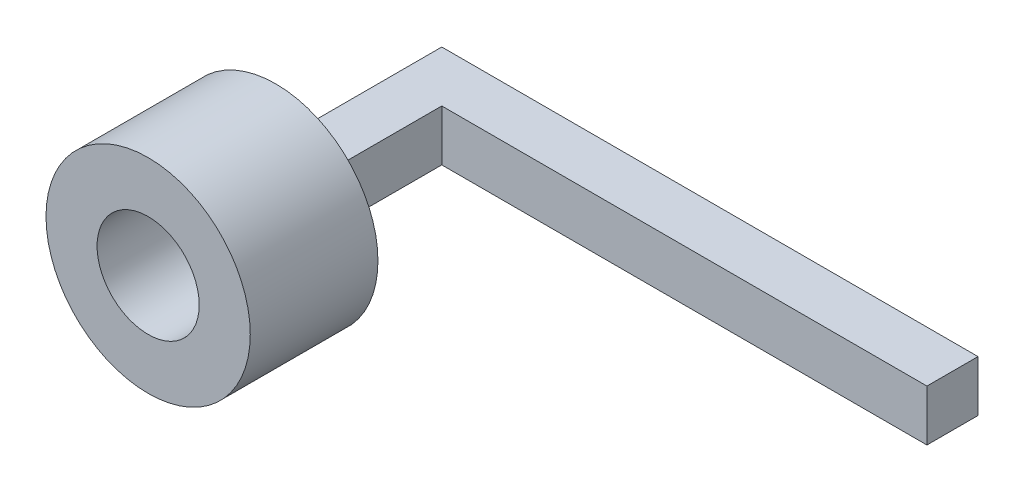
ISO-10303-21;
HEADER;
FILE_DESCRIPTION(('STEP AP214'),'2;1');
FILE_NAME('part.step','',(''),(''),'','','');
FILE_SCHEMA(('AUTOMOTIVE_DESIGN { 1 0 10303 214 1 1 1 1 }'));
ENDSEC;
DATA;
#1=APPLICATION_CONTEXT('core data for automotive mechanical design processes');
#2=APPLICATION_PROTOCOL_DEFINITION('international standard','automotive_design',2000,#1);
#3=PRODUCT_CONTEXT('',#1,'mechanical');
#4=PRODUCT('Part','Part','',(#3));
#5=PRODUCT_RELATED_PRODUCT_CATEGORY('part','',(#4));
#6=PRODUCT_DEFINITION_FORMATION('','',#4);
#7=PRODUCT_DEFINITION_CONTEXT('part definition',#1,'design');
#8=PRODUCT_DEFINITION('design','',#6,#7);
#9=PRODUCT_DEFINITION_SHAPE('','',#8);
#10=(LENGTH_UNIT() NAMED_UNIT(*) SI_UNIT(.MILLI.,.METRE.));
#11=(NAMED_UNIT(*) PLANE_ANGLE_UNIT() SI_UNIT($,.RADIAN.));
#12=(NAMED_UNIT(*) SI_UNIT($,.STERADIAN.) SOLID_ANGLE_UNIT());
#13=UNCERTAINTY_MEASURE_WITH_UNIT(LENGTH_MEASURE(1.E-05),#10,'distance_accuracy_value','');
#14=(GEOMETRIC_REPRESENTATION_CONTEXT(3) GLOBAL_UNCERTAINTY_ASSIGNED_CONTEXT((#13)) GLOBAL_UNIT_ASSIGNED_CONTEXT((#10,
#11,#12)) REPRESENTATION_CONTEXT('',''));
#15=CARTESIAN_POINT('',(0.,0.,0.));
#16=DIRECTION('',(0.,0.,1.));
#17=DIRECTION('',(1.,0.,0.));
#18=AXIS2_PLACEMENT_3D('',#15,#16,#17);
#19=CARTESIAN_POINT('',(0.5,-0.5,-3.75));
#20=DIRECTION('',(-1.,0.,0.));
#21=DIRECTION('',(0.,0.,1.));
#22=AXIS2_PLACEMENT_3D('',#19,#20,#21);
#23=PLANE('',#22);
#24=DIRECTION('',(0.,-1.,0.));
#25=VECTOR('',#24,1.);
#26=CARTESIAN_POINT('',(0.5,0.5,-2.75));
#27=LINE('',#26,#25);
#28=CARTESIAN_POINT('',(0.5,0.5,-2.75));
#29=VERTEX_POINT('',#28);
#30=CARTESIAN_POINT('',(0.5,-0.5,-2.75));
#31=VERTEX_POINT('',#30);
#32=EDGE_CURVE('E123',#29,#31,#27,.T.);
#33=ORIENTED_EDGE('',*,*,#32,.F.);
#34=DIRECTION('',(0.,0.,1.));
#35=VECTOR('',#34,1.);
#36=CARTESIAN_POINT('',(0.5,0.5,-3.75));
#37=LINE('',#36,#35);
#38=CARTESIAN_POINT('',(0.5,0.5,0.));
#39=VERTEX_POINT('',#38);
#40=EDGE_CURVE('E57',#29,#39,#37,.T.);
#41=ORIENTED_EDGE('',*,*,#40,.T.);
#42=DIRECTION('',(0.,-1.,0.));
#43=VECTOR('',#42,1.);
#44=CARTESIAN_POINT('',(0.5,-0.5,0.));
#45=LINE('',#44,#43);
#46=CARTESIAN_POINT('',(0.5,-0.5,0.));
#47=VERTEX_POINT('',#46);
#48=EDGE_CURVE('E138',#39,#47,#45,.T.);
#49=ORIENTED_EDGE('',*,*,#48,.T.);
#50=DIRECTION('',(0.,0.,1.));
#51=VECTOR('',#50,1.);
#52=CARTESIAN_POINT('',(0.5,-0.5,-3.75));
#53=LINE('',#52,#51);
#54=EDGE_CURVE('E164',#31,#47,#53,.T.);
#55=ORIENTED_EDGE('',*,*,#54,.F.);
#56=EDGE_LOOP('',(#33,#41,#49,#55));
#57=FACE_BOUND('',#56,.T.);
#58=ADVANCED_FACE('F41',(#57),#23,.F.);
#59=CARTESIAN_POINT('',(0.,0.,0.));
#60=DIRECTION('',(0.,0.,1.));
#61=DIRECTION('',(1.,0.,0.));
#62=AXIS2_PLACEMENT_3D('',#59,#60,#61);
#63=PLANE('',#62);
#64=CARTESIAN_POINT('',(0.,0.,0.));
#65=DIRECTION('',(0.,0.,1.));
#66=DIRECTION('',(1.,0.,0.));
#67=AXIS2_PLACEMENT_3D('',#64,#65,#66);
#68=CIRCLE('',#67,2.);
#69=CARTESIAN_POINT('',(2.,0.,0.));
#70=VERTEX_POINT('',#69);
#71=EDGE_CURVE('E45',#70,#70,#68,.T.);
#72=ORIENTED_EDGE('',*,*,#71,.F.);
#73=EDGE_LOOP('',(#72));
#74=FACE_BOUND('',#73,.T.);
#75=ORIENTED_EDGE('',*,*,#48,.F.);
#76=DIRECTION('',(1.,0.,0.));
#77=VECTOR('',#76,1.);
#78=CARTESIAN_POINT('',(-0.5,0.5,0.));
#79=LINE('',#78,#77);
#80=CARTESIAN_POINT('',(-0.5,0.5,0.));
#81=VERTEX_POINT('',#80);
#82=EDGE_CURVE('E64',#81,#39,#79,.T.);
#83=ORIENTED_EDGE('',*,*,#82,.F.);
#84=DIRECTION('',(0.,1.,0.));
#85=VECTOR('',#84,1.);
#86=CARTESIAN_POINT('',(-0.5,-0.5,0.));
#87=LINE('',#86,#85);
#88=CARTESIAN_POINT('',(-0.5,-0.5,0.));
#89=VERTEX_POINT('',#88);
#90=EDGE_CURVE('E150',#89,#81,#87,.T.);
#91=ORIENTED_EDGE('',*,*,#90,.F.);
#92=DIRECTION('',(-1.,0.,0.));
#93=VECTOR('',#92,1.);
#94=CARTESIAN_POINT('',(-0.5,-0.5,0.));
#95=LINE('',#94,#93);
#96=EDGE_CURVE('E146',#47,#89,#95,.T.);
#97=ORIENTED_EDGE('',*,*,#96,.F.);
#98=EDGE_LOOP('',(#75,#83,#91,#97));
#99=FACE_BOUND('',#98,.T.);
#100=ADVANCED_FACE('F181',(#74,#99),#63,.F.);
#101=CARTESIAN_POINT('',(0.,0.,2.5));
#102=DIRECTION('',(0.,0.,-1.));
#103=DIRECTION('',(-1.,0.,0.));
#104=AXIS2_PLACEMENT_3D('',#101,#102,#103);
#105=CYLINDRICAL_SURFACE('',#104,2.);
#106=CARTESIAN_POINT('',(0.,0.,2.5));
#107=DIRECTION('',(0.,0.,1.));
#108=DIRECTION('',(1.,0.,0.));
#109=AXIS2_PLACEMENT_3D('',#106,#107,#108);
#110=CIRCLE('',#109,2.);
#111=CARTESIAN_POINT('',(2.,0.,2.5));
#112=VERTEX_POINT('',#111);
#113=EDGE_CURVE('E11',#112,#112,#110,.T.);
#114=ORIENTED_EDGE('',*,*,#113,.F.);
#115=EDGE_LOOP('',(#114));
#116=FACE_BOUND('',#115,.T.);
#117=ORIENTED_EDGE('',*,*,#71,.T.);
#118=EDGE_LOOP('',(#117));
#119=FACE_BOUND('',#118,.T.);
#120=ADVANCED_FACE('F43',(#116,#119),#105,.T.);
#121=CARTESIAN_POINT('',(0.,0.,2.5));
#122=DIRECTION('',(0.,0.,1.));
#123=DIRECTION('',(1.,0.,0.));
#124=AXIS2_PLACEMENT_3D('',#121,#122,#123);
#125=PLANE('',#124);
#126=CARTESIAN_POINT('',(0.,0.,2.5));
#127=DIRECTION('',(0.,0.,1.));
#128=DIRECTION('',(1.,0.,0.));
#129=AXIS2_PLACEMENT_3D('',#126,#127,#128);
#130=CIRCLE('',#129,1.);
#131=CARTESIAN_POINT('',(1.,0.,2.5));
#132=VERTEX_POINT('',#131);
#133=EDGE_CURVE('E171',#132,#132,#130,.T.);
#134=ORIENTED_EDGE('',*,*,#133,.F.);
#135=EDGE_LOOP('',(#134));
#136=FACE_BOUND('',#135,.T.);
#137=ORIENTED_EDGE('',*,*,#113,.T.);
#138=EDGE_LOOP('',(#137));
#139=FACE_BOUND('',#138,.T.);
#140=ADVANCED_FACE('F212',(#136,#139),#125,.T.);
#141=CARTESIAN_POINT('',(0.,0.,2.5));
#142=DIRECTION('',(0.,0.,-1.));
#143=DIRECTION('',(-1.,0.,0.));
#144=AXIS2_PLACEMENT_3D('',#141,#142,#143);
#145=CYLINDRICAL_SURFACE('',#144,1.);
#146=ORIENTED_EDGE('',*,*,#133,.T.);
#147=EDGE_LOOP('',(#146));
#148=FACE_BOUND('',#147,.T.);
#149=CARTESIAN_POINT('',(0.,0.,1.));
#150=DIRECTION('',(0.,0.,1.));
#151=DIRECTION('',(1.,0.,0.));
#152=AXIS2_PLACEMENT_3D('',#149,#150,#151);
#153=CIRCLE('',#152,1.);
#154=CARTESIAN_POINT('',(1.,0.,1.));
#155=VERTEX_POINT('',#154);
#156=EDGE_CURVE('E167',#155,#155,#153,.T.);
#157=ORIENTED_EDGE('',*,*,#156,.F.);
#158=EDGE_LOOP('',(#157));
#159=FACE_BOUND('',#158,.T.);
#160=ADVANCED_FACE('F208',(#148,#159),#145,.F.);
#161=CARTESIAN_POINT('',(0.,0.,1.));
#162=DIRECTION('',(0.,0.,1.));
#163=DIRECTION('',(1.,0.,0.));
#164=AXIS2_PLACEMENT_3D('',#161,#162,#163);
#165=PLANE('',#164);
#166=ORIENTED_EDGE('',*,*,#156,.T.);
#167=EDGE_LOOP('',(#166));
#168=FACE_BOUND('',#167,.T.);
#169=ADVANCED_FACE('F211',(#168),#165,.T.);
#170=CARTESIAN_POINT('',(-0.5,-0.5,-3.75));
#171=DIRECTION('',(0.,1.,0.));
#172=DIRECTION('',(-1.,0.,0.));
#173=AXIS2_PLACEMENT_3D('',#170,#171,#172);
#174=PLANE('',#173);
#175=ORIENTED_EDGE('',*,*,#96,.T.);
#176=DIRECTION('',(0.,0.,1.));
#177=VECTOR('',#176,1.);
#178=CARTESIAN_POINT('',(-0.5,-0.5,-3.75));
#179=LINE('',#178,#177);
#180=CARTESIAN_POINT('',(-0.5,-0.5,-3.75));
#181=VERTEX_POINT('',#180);
#182=EDGE_CURVE('E160',#181,#89,#179,.T.);
#183=ORIENTED_EDGE('',*,*,#182,.F.);
#184=DIRECTION('',(-1.,0.,0.));
#185=VECTOR('',#184,1.);
#186=CARTESIAN_POINT('',(-0.5,-0.5,-3.75));
#187=LINE('',#186,#185);
#188=CARTESIAN_POINT('',(10.,-0.5,-3.75));
#189=VERTEX_POINT('',#188);
#190=EDGE_CURVE('E139',#189,#181,#187,.T.);
#191=ORIENTED_EDGE('',*,*,#190,.F.);
#192=DIRECTION('',(0.,0.,-1.));
#193=VECTOR('',#192,1.);
#194=CARTESIAN_POINT('',(10.,-0.5,-3.75));
#195=LINE('',#194,#193);
#196=CARTESIAN_POINT('',(10.,-0.5,-2.75));
#197=VERTEX_POINT('',#196);
#198=EDGE_CURVE('E121',#197,#189,#195,.T.);
#199=ORIENTED_EDGE('',*,*,#198,.F.);
#200=DIRECTION('',(-1.,0.,0.));
#201=VECTOR('',#200,1.);
#202=CARTESIAN_POINT('',(10.,-0.5,-2.75));
#203=LINE('',#202,#201);
#204=EDGE_CURVE('E131',#197,#31,#203,.T.);
#205=ORIENTED_EDGE('',*,*,#204,.T.);
#206=ORIENTED_EDGE('',*,*,#54,.T.);
#207=EDGE_LOOP('',(#175,#183,#191,#199,#205,#206));
#208=FACE_BOUND('',#207,.T.);
#209=ADVANCED_FACE('F189',(#208),#174,.F.);
#210=CARTESIAN_POINT('',(-0.5,-0.5,-3.75));
#211=DIRECTION('',(1.,0.,0.));
#212=DIRECTION('',(0.,0.,-1.));
#213=AXIS2_PLACEMENT_3D('',#210,#211,#212);
#214=PLANE('',#213);
#215=ORIENTED_EDGE('',*,*,#90,.T.);
#216=DIRECTION('',(0.,0.,1.));
#217=VECTOR('',#216,1.);
#218=CARTESIAN_POINT('',(-0.5,0.5,-3.75));
#219=LINE('',#218,#217);
#220=CARTESIAN_POINT('',(-0.5,0.5,-3.75));
#221=VERTEX_POINT('',#220);
#222=EDGE_CURVE('E157',#221,#81,#219,.T.);
#223=ORIENTED_EDGE('',*,*,#222,.F.);
#224=DIRECTION('',(0.,1.,0.));
#225=VECTOR('',#224,1.);
#226=CARTESIAN_POINT('',(-0.5,-0.5,-3.75));
#227=LINE('',#226,#225);
#228=EDGE_CURVE('E103',#181,#221,#227,.T.);
#229=ORIENTED_EDGE('',*,*,#228,.F.);
#230=ORIENTED_EDGE('',*,*,#182,.T.);
#231=EDGE_LOOP('',(#215,#223,#229,#230));
#232=FACE_BOUND('',#231,.T.);
#233=ADVANCED_FACE('F186',(#232),#214,.F.);
#234=CARTESIAN_POINT('',(-0.5,0.5,-3.75));
#235=DIRECTION('',(0.,-1.,0.));
#236=DIRECTION('',(1.,0.,0.));
#237=AXIS2_PLACEMENT_3D('',#234,#235,#236);
#238=PLANE('',#237);
#239=ORIENTED_EDGE('',*,*,#82,.T.);
#240=ORIENTED_EDGE('',*,*,#40,.F.);
#241=DIRECTION('',(-1.,0.,0.));
#242=VECTOR('',#241,1.);
#243=CARTESIAN_POINT('',(10.,0.5,-2.75));
#244=LINE('',#243,#242);
#245=CARTESIAN_POINT('',(10.,0.5,-2.75));
#246=VERTEX_POINT('',#245);
#247=EDGE_CURVE('E112',#246,#29,#244,.T.);
#248=ORIENTED_EDGE('',*,*,#247,.F.);
#249=DIRECTION('',(0.,0.,1.));
#250=VECTOR('',#249,1.);
#251=CARTESIAN_POINT('',(10.,0.5,-3.75));
#252=LINE('',#251,#250);
#253=CARTESIAN_POINT('',(10.,0.5,-3.75));
#254=VERTEX_POINT('',#253);
#255=EDGE_CURVE('E110',#254,#246,#252,.T.);
#256=ORIENTED_EDGE('',*,*,#255,.F.);
#257=DIRECTION('',(1.,0.,0.));
#258=VECTOR('',#257,1.);
#259=CARTESIAN_POINT('',(-0.5,0.5,-3.75));
#260=LINE('',#259,#258);
#261=EDGE_CURVE('E97',#221,#254,#260,.T.);
#262=ORIENTED_EDGE('',*,*,#261,.F.);
#263=ORIENTED_EDGE('',*,*,#222,.T.);
#264=EDGE_LOOP('',(#239,#240,#248,#256,#262,#263));
#265=FACE_BOUND('',#264,.T.);
#266=ADVANCED_FACE('F111',(#265),#238,.F.);
#267=CARTESIAN_POINT('',(0.,0.,-3.75));
#268=DIRECTION('',(0.,0.,-1.));
#269=DIRECTION('',(-1.,0.,0.));
#270=AXIS2_PLACEMENT_3D('',#267,#268,#269);
#271=PLANE('',#270);
#272=ORIENTED_EDGE('',*,*,#261,.T.);
#273=DIRECTION('',(0.,1.,0.));
#274=VECTOR('',#273,1.);
#275=CARTESIAN_POINT('',(10.,0.5,-3.75));
#276=LINE('',#275,#274);
#277=EDGE_CURVE('E101',#189,#254,#276,.T.);
#278=ORIENTED_EDGE('',*,*,#277,.F.);
#279=ORIENTED_EDGE('',*,*,#190,.T.);
#280=ORIENTED_EDGE('',*,*,#228,.T.);
#281=EDGE_LOOP('',(#272,#278,#279,#280));
#282=FACE_BOUND('',#281,.T.);
#283=ADVANCED_FACE('F99',(#282),#271,.T.);
#284=CARTESIAN_POINT('',(10.,0.5,-2.75));
#285=DIRECTION('',(0.,0.,-1.));
#286=DIRECTION('',(-1.,0.,0.));
#287=AXIS2_PLACEMENT_3D('',#284,#285,#286);
#288=PLANE('',#287);
#289=ORIENTED_EDGE('',*,*,#32,.T.);
#290=ORIENTED_EDGE('',*,*,#204,.F.);
#291=DIRECTION('',(0.,-1.,0.));
#292=VECTOR('',#291,1.);
#293=CARTESIAN_POINT('',(10.,0.5,-2.75));
#294=LINE('',#293,#292);
#295=EDGE_CURVE('E116',#246,#197,#294,.T.);
#296=ORIENTED_EDGE('',*,*,#295,.F.);
#297=ORIENTED_EDGE('',*,*,#247,.T.);
#298=EDGE_LOOP('',(#289,#290,#296,#297));
#299=FACE_BOUND('',#298,.T.);
#300=ADVANCED_FACE('F192',(#299),#288,.F.);
#301=CARTESIAN_POINT('',(10.,0.,0.));
#302=DIRECTION('',(-1.,0.,0.));
#303=DIRECTION('',(0.,0.,1.));
#304=AXIS2_PLACEMENT_3D('',#301,#302,#303);
#305=PLANE('',#304);
#306=ORIENTED_EDGE('',*,*,#277,.T.);
#307=ORIENTED_EDGE('',*,*,#255,.T.);
#308=ORIENTED_EDGE('',*,*,#295,.T.);
#309=ORIENTED_EDGE('',*,*,#198,.T.);
#310=EDGE_LOOP('',(#306,#307,#308,#309));
#311=FACE_BOUND('',#310,.T.);
#312=ADVANCED_FACE('F119',(#311),#305,.F.);
#313=CLOSED_SHELL('',(#58,#100,#120,#140,#160,#169,#209,#233,#266,#283,#300,#312));
#314=MANIFOLD_SOLID_BREP('B2',#313);
#315=ADVANCED_BREP_SHAPE_REPRESENTATION('',(#18,#314),#14);
#316=SHAPE_DEFINITION_REPRESENTATION(#9,#315);
ENDSEC;
END-ISO-10303-21;
